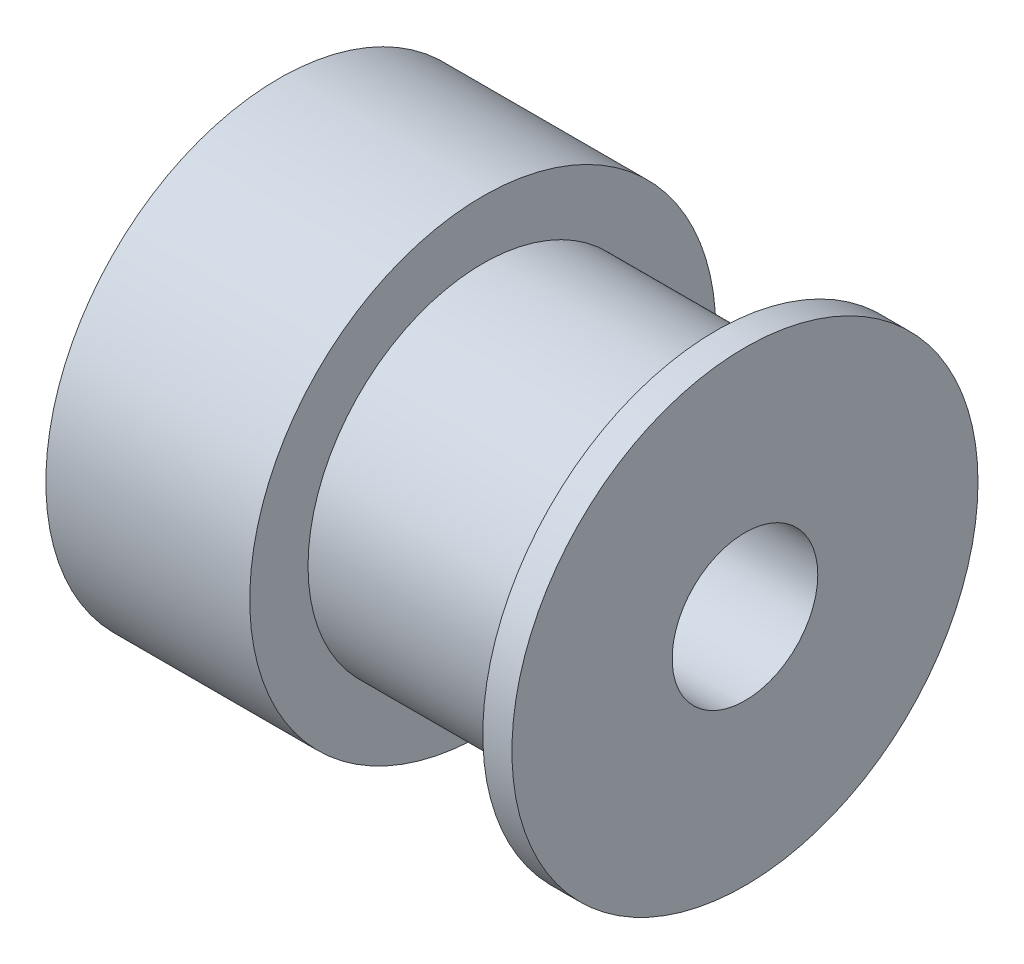
ISO-10303-21;
HEADER;
FILE_DESCRIPTION(('STEP AP214'),'2;1');
FILE_NAME('part.step','',(''),(''),'','','');
FILE_SCHEMA(('AUTOMOTIVE_DESIGN { 1 0 10303 214 1 1 1 1 }'));
ENDSEC;
DATA;
#1=APPLICATION_CONTEXT('core data for automotive mechanical design processes');
#2=APPLICATION_PROTOCOL_DEFINITION('international standard','automotive_design',2000,#1);
#3=PRODUCT_CONTEXT('',#1,'mechanical');
#4=PRODUCT('Part','Part','',(#3));
#5=PRODUCT_RELATED_PRODUCT_CATEGORY('part','',(#4));
#6=PRODUCT_DEFINITION_FORMATION('','',#4);
#7=PRODUCT_DEFINITION_CONTEXT('part definition',#1,'design');
#8=PRODUCT_DEFINITION('design','',#6,#7);
#9=PRODUCT_DEFINITION_SHAPE('','',#8);
#10=(LENGTH_UNIT() NAMED_UNIT(*) SI_UNIT(.MILLI.,.METRE.));
#11=(NAMED_UNIT(*) PLANE_ANGLE_UNIT() SI_UNIT($,.RADIAN.));
#12=(NAMED_UNIT(*) SI_UNIT($,.STERADIAN.) SOLID_ANGLE_UNIT());
#13=UNCERTAINTY_MEASURE_WITH_UNIT(LENGTH_MEASURE(1.E-05),#10,'distance_accuracy_value','');
#14=(GEOMETRIC_REPRESENTATION_CONTEXT(3) GLOBAL_UNCERTAINTY_ASSIGNED_CONTEXT((#13)) GLOBAL_UNIT_ASSIGNED_CONTEXT((#10,
#11,#12)) REPRESENTATION_CONTEXT('',''));
#15=CARTESIAN_POINT('',(0.,0.,0.));
#16=DIRECTION('',(0.,0.,1.));
#17=DIRECTION('',(1.,0.,0.));
#18=AXIS2_PLACEMENT_3D('',#15,#16,#17);
#19=CARTESIAN_POINT('',(0.,8.,0.));
#20=DIRECTION('',(1.,0.,0.));
#21=DIRECTION('',(0.,0.,-1.));
#22=AXIS2_PLACEMENT_3D('',#19,#20,#21);
#23=PLANE('',#22);
#24=CARTESIAN_POINT('',(0.,0.,0.));
#25=DIRECTION('',(1.,0.,0.));
#26=DIRECTION('',(0.,0.,-1.));
#27=AXIS2_PLACEMENT_3D('',#24,#25,#26);
#28=CIRCLE('',#27,8.);
#29=CARTESIAN_POINT('',(0.,0.,-8.));
#30=VERTEX_POINT('',#29);
#31=EDGE_CURVE('E59',#30,#30,#28,.T.);
#32=ORIENTED_EDGE('',*,*,#31,.T.);
#33=EDGE_LOOP('',(#32));
#34=FACE_BOUND('',#33,.T.);
#35=CARTESIAN_POINT('',(0.,0.,0.));
#36=DIRECTION('',(1.,0.,0.));
#37=DIRECTION('',(0.,0.,-1.));
#38=AXIS2_PLACEMENT_3D('',#35,#36,#37);
#39=CIRCLE('',#38,2.5);
#40=CARTESIAN_POINT('',(0.,0.,-2.5));
#41=VERTEX_POINT('',#40);
#42=EDGE_CURVE('E10',#41,#41,#39,.T.);
#43=ORIENTED_EDGE('',*,*,#42,.F.);
#44=EDGE_LOOP('',(#43));
#45=FACE_BOUND('',#44,.T.);
#46=ADVANCED_FACE('F31',(#34,#45),#23,.T.);
#47=CARTESIAN_POINT('',(0.,0.,0.));
#48=DIRECTION('',(1.,0.,0.));
#49=DIRECTION('',(0.,0.,-1.));
#50=AXIS2_PLACEMENT_3D('',#47,#48,#49);
#51=CYLINDRICAL_SURFACE('',#50,2.5);
#52=ORIENTED_EDGE('',*,*,#42,.T.);
#53=EDGE_LOOP('',(#52));
#54=FACE_BOUND('',#53,.T.);
#55=CARTESIAN_POINT('',(-16.,0.,0.));
#56=DIRECTION('',(1.,0.,0.));
#57=DIRECTION('',(0.,0.,-1.));
#58=AXIS2_PLACEMENT_3D('',#55,#56,#57);
#59=CIRCLE('',#58,2.5);
#60=CARTESIAN_POINT('',(-16.,0.,-2.5));
#61=VERTEX_POINT('',#60);
#62=EDGE_CURVE('E37',#61,#61,#59,.T.);
#63=ORIENTED_EDGE('',*,*,#62,.F.);
#64=EDGE_LOOP('',(#63));
#65=FACE_BOUND('',#64,.T.);
#66=ADVANCED_FACE('F77',(#54,#65),#51,.F.);
#67=CARTESIAN_POINT('',(-16.,2.5,0.));
#68=DIRECTION('',(-1.,0.,0.));
#69=DIRECTION('',(0.,0.,1.));
#70=AXIS2_PLACEMENT_3D('',#67,#68,#69);
#71=PLANE('',#70);
#72=ORIENTED_EDGE('',*,*,#62,.T.);
#73=EDGE_LOOP('',(#72));
#74=FACE_BOUND('',#73,.T.);
#75=CARTESIAN_POINT('',(-16.,0.,0.));
#76=DIRECTION('',(1.,0.,0.));
#77=DIRECTION('',(0.,0.,-1.));
#78=AXIS2_PLACEMENT_3D('',#75,#76,#77);
#79=CIRCLE('',#78,8.);
#80=CARTESIAN_POINT('',(-16.,0.,-8.));
#81=VERTEX_POINT('',#80);
#82=EDGE_CURVE('E41',#81,#81,#79,.T.);
#83=ORIENTED_EDGE('',*,*,#82,.F.);
#84=EDGE_LOOP('',(#83));
#85=FACE_BOUND('',#84,.T.);
#86=ADVANCED_FACE('F81',(#74,#85),#71,.T.);
#87=CARTESIAN_POINT('',(0.,0.,0.));
#88=DIRECTION('',(1.,0.,0.));
#89=DIRECTION('',(0.,0.,-1.));
#90=AXIS2_PLACEMENT_3D('',#87,#88,#89);
#91=CYLINDRICAL_SURFACE('',#90,8.);
#92=ORIENTED_EDGE('',*,*,#82,.T.);
#93=EDGE_LOOP('',(#92));
#94=FACE_BOUND('',#93,.T.);
#95=CARTESIAN_POINT('',(-9.,0.,0.));
#96=DIRECTION('',(1.,0.,0.));
#97=DIRECTION('',(0.,0.,-1.));
#98=AXIS2_PLACEMENT_3D('',#95,#96,#97);
#99=CIRCLE('',#98,7.99999999999999);
#100=CARTESIAN_POINT('',(-9.,0.,-7.99999999999999));
#101=VERTEX_POINT('',#100);
#102=EDGE_CURVE('E45',#101,#101,#99,.T.);
#103=ORIENTED_EDGE('',*,*,#102,.F.);
#104=EDGE_LOOP('',(#103));
#105=FACE_BOUND('',#104,.T.);
#106=ADVANCED_FACE('F85',(#94,#105),#91,.T.);
#107=CARTESIAN_POINT('',(-9.,7.99999999999999,0.));
#108=DIRECTION('',(1.,0.,0.));
#109=DIRECTION('',(0.,0.,-1.));
#110=AXIS2_PLACEMENT_3D('',#107,#108,#109);
#111=PLANE('',#110);
#112=ORIENTED_EDGE('',*,*,#102,.T.);
#113=EDGE_LOOP('',(#112));
#114=FACE_BOUND('',#113,.T.);
#115=CARTESIAN_POINT('',(-9.,0.,0.));
#116=DIRECTION('',(1.,0.,0.));
#117=DIRECTION('',(0.,0.,-1.));
#118=AXIS2_PLACEMENT_3D('',#115,#116,#117);
#119=CIRCLE('',#118,6.);
#120=CARTESIAN_POINT('',(-9.,0.,-6.));
#121=VERTEX_POINT('',#120);
#122=EDGE_CURVE('E50',#121,#121,#119,.T.);
#123=ORIENTED_EDGE('',*,*,#122,.F.);
#124=EDGE_LOOP('',(#123));
#125=FACE_BOUND('',#124,.T.);
#126=ADVANCED_FACE('F91',(#114,#125),#111,.T.);
#127=CARTESIAN_POINT('',(0.,0.,0.));
#128=DIRECTION('',(1.,0.,0.));
#129=DIRECTION('',(0.,0.,-1.));
#130=AXIS2_PLACEMENT_3D('',#127,#128,#129);
#131=CYLINDRICAL_SURFACE('',#130,6.);
#132=ORIENTED_EDGE('',*,*,#122,.T.);
#133=EDGE_LOOP('',(#132));
#134=FACE_BOUND('',#133,.T.);
#135=CARTESIAN_POINT('',(-1.,0.,0.));
#136=DIRECTION('',(1.,0.,0.));
#137=DIRECTION('',(0.,0.,-1.));
#138=AXIS2_PLACEMENT_3D('',#135,#136,#137);
#139=CIRCLE('',#138,6.);
#140=CARTESIAN_POINT('',(-1.,0.,-6.));
#141=VERTEX_POINT('',#140);
#142=EDGE_CURVE('E53',#141,#141,#139,.T.);
#143=ORIENTED_EDGE('',*,*,#142,.F.);
#144=EDGE_LOOP('',(#143));
#145=FACE_BOUND('',#144,.T.);
#146=ADVANCED_FACE('F73',(#134,#145),#131,.T.);
#147=CARTESIAN_POINT('',(-0.999999999999999,6.,0.));
#148=DIRECTION('',(-1.,0.,0.));
#149=DIRECTION('',(0.,0.,1.));
#150=AXIS2_PLACEMENT_3D('',#147,#148,#149);
#151=PLANE('',#150);
#152=ORIENTED_EDGE('',*,*,#142,.T.);
#153=EDGE_LOOP('',(#152));
#154=FACE_BOUND('',#153,.T.);
#155=CARTESIAN_POINT('',(-0.999999999999999,0.,0.));
#156=DIRECTION('',(1.,0.,0.));
#157=DIRECTION('',(0.,0.,-1.));
#158=AXIS2_PLACEMENT_3D('',#155,#156,#157);
#159=CIRCLE('',#158,8.);
#160=CARTESIAN_POINT('',(-0.999999999999999,0.,-8.));
#161=VERTEX_POINT('',#160);
#162=EDGE_CURVE('E56',#161,#161,#159,.T.);
#163=ORIENTED_EDGE('',*,*,#162,.F.);
#164=EDGE_LOOP('',(#163));
#165=FACE_BOUND('',#164,.T.);
#166=ADVANCED_FACE('F67',(#154,#165),#151,.T.);
#167=CARTESIAN_POINT('',(0.,0.,0.));
#168=DIRECTION('',(1.,0.,0.));
#169=DIRECTION('',(0.,0.,-1.));
#170=AXIS2_PLACEMENT_3D('',#167,#168,#169);
#171=CYLINDRICAL_SURFACE('',#170,8.);
#172=ORIENTED_EDGE('',*,*,#162,.T.);
#173=EDGE_LOOP('',(#172));
#174=FACE_BOUND('',#173,.T.);
#175=ORIENTED_EDGE('',*,*,#31,.F.);
#176=EDGE_LOOP('',(#175));
#177=FACE_BOUND('',#176,.T.);
#178=ADVANCED_FACE('F65',(#174,#177),#171,.T.);
#179=CLOSED_SHELL('',(#46,#66,#86,#106,#126,#146,#166,#178));
#180=MANIFOLD_SOLID_BREP('B2',#179);
#181=ADVANCED_BREP_SHAPE_REPRESENTATION('',(#18,#180),#14);
#182=SHAPE_DEFINITION_REPRESENTATION(#9,#181);
ENDSEC;
END-ISO-10303-21;
